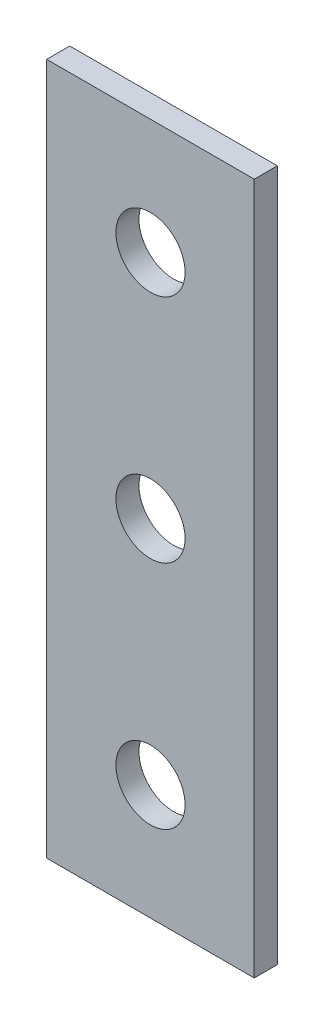
ISO-10303-21;
HEADER;
FILE_DESCRIPTION(('STEP AP214'),'2;1');
FILE_NAME('part.step','',(''),(''),'','','');
FILE_SCHEMA(('AUTOMOTIVE_DESIGN { 1 0 10303 214 1 1 1 1 }'));
ENDSEC;
DATA;
#1=APPLICATION_CONTEXT('core data for automotive mechanical design processes');
#2=APPLICATION_PROTOCOL_DEFINITION('international standard','automotive_design',2000,#1);
#3=PRODUCT_CONTEXT('',#1,'mechanical');
#4=PRODUCT('Part','Part','',(#3));
#5=PRODUCT_RELATED_PRODUCT_CATEGORY('part','',(#4));
#6=PRODUCT_DEFINITION_FORMATION('','',#4);
#7=PRODUCT_DEFINITION_CONTEXT('part definition',#1,'design');
#8=PRODUCT_DEFINITION('design','',#6,#7);
#9=PRODUCT_DEFINITION_SHAPE('','',#8);
#10=(LENGTH_UNIT() NAMED_UNIT(*) SI_UNIT(.MILLI.,.METRE.));
#11=(NAMED_UNIT(*) PLANE_ANGLE_UNIT() SI_UNIT($,.RADIAN.));
#12=(NAMED_UNIT(*) SI_UNIT($,.STERADIAN.) SOLID_ANGLE_UNIT());
#13=UNCERTAINTY_MEASURE_WITH_UNIT(LENGTH_MEASURE(1.E-05),#10,'distance_accuracy_value','');
#14=(GEOMETRIC_REPRESENTATION_CONTEXT(3) GLOBAL_UNCERTAINTY_ASSIGNED_CONTEXT((#13)) GLOBAL_UNIT_ASSIGNED_CONTEXT((#10,
#11,#12)) REPRESENTATION_CONTEXT('',''));
#15=CARTESIAN_POINT('',(0.,0.,0.));
#16=DIRECTION('',(0.,0.,1.));
#17=DIRECTION('',(1.,0.,0.));
#18=AXIS2_PLACEMENT_3D('',#15,#16,#17);
#19=CARTESIAN_POINT('',(0.,0.,1.));
#20=DIRECTION('',(0.,0.,-1.));
#21=DIRECTION('',(-1.,0.,0.));
#22=AXIS2_PLACEMENT_3D('',#19,#20,#21);
#23=PLANE('',#22);
#24=DIRECTION('',(1.,0.,0.));
#25=VECTOR('',#24,1.);
#26=CARTESIAN_POINT('',(9.,0.,1.));
#27=LINE('',#26,#25);
#28=CARTESIAN_POINT('',(0.,0.,1.));
#29=VERTEX_POINT('',#28);
#30=CARTESIAN_POINT('',(9.,0.,1.));
#31=VERTEX_POINT('',#30);
#32=EDGE_CURVE('E92',#29,#31,#27,.T.);
#33=ORIENTED_EDGE('',*,*,#32,.T.);
#34=DIRECTION('',(0.,1.,0.));
#35=VECTOR('',#34,1.);
#36=CARTESIAN_POINT('',(9.,30.,1.));
#37=LINE('',#36,#35);
#38=CARTESIAN_POINT('',(9.,30.,1.));
#39=VERTEX_POINT('',#38);
#40=EDGE_CURVE('E87',#31,#39,#37,.T.);
#41=ORIENTED_EDGE('',*,*,#40,.T.);
#42=DIRECTION('',(-1.,0.,0.));
#43=VECTOR('',#42,1.);
#44=CARTESIAN_POINT('',(0.,30.,1.));
#45=LINE('',#44,#43);
#46=CARTESIAN_POINT('',(0.,30.,1.));
#47=VERTEX_POINT('',#46);
#48=EDGE_CURVE('E90',#39,#47,#45,.T.);
#49=ORIENTED_EDGE('',*,*,#48,.T.);
#50=DIRECTION('',(0.,-1.,0.));
#51=VECTOR('',#50,1.);
#52=CARTESIAN_POINT('',(0.,0.,1.));
#53=LINE('',#52,#51);
#54=EDGE_CURVE('E57',#47,#29,#53,.T.);
#55=ORIENTED_EDGE('',*,*,#54,.T.);
#56=EDGE_LOOP('',(#33,#41,#49,#55));
#57=FACE_BOUND('',#56,.T.);
#58=CARTESIAN_POINT('',(4.5,25.,1.));
#59=DIRECTION('',(0.,0.,1.));
#60=DIRECTION('',(1.,0.,0.));
#61=AXIS2_PLACEMENT_3D('',#58,#59,#60);
#62=CIRCLE('',#61,1.5);
#63=CARTESIAN_POINT('',(6.,25.,1.));
#64=VERTEX_POINT('',#63);
#65=EDGE_CURVE('E112',#64,#64,#62,.T.);
#66=ORIENTED_EDGE('',*,*,#65,.F.);
#67=EDGE_LOOP('',(#66));
#68=FACE_BOUND('',#67,.T.);
#69=CARTESIAN_POINT('',(4.5,15.,1.));
#70=DIRECTION('',(0.,0.,1.));
#71=DIRECTION('',(1.,0.,0.));
#72=AXIS2_PLACEMENT_3D('',#69,#70,#71);
#73=CIRCLE('',#72,1.5);
#74=CARTESIAN_POINT('',(6.,15.,1.));
#75=VERTEX_POINT('',#74);
#76=EDGE_CURVE('E134',#75,#75,#73,.T.);
#77=ORIENTED_EDGE('',*,*,#76,.F.);
#78=EDGE_LOOP('',(#77));
#79=FACE_BOUND('',#78,.T.);
#80=CARTESIAN_POINT('',(4.5,5.,1.));
#81=DIRECTION('',(0.,0.,1.));
#82=DIRECTION('',(1.,0.,0.));
#83=AXIS2_PLACEMENT_3D('',#80,#81,#82);
#84=CIRCLE('',#83,1.5);
#85=CARTESIAN_POINT('',(6.,5.,1.));
#86=VERTEX_POINT('',#85);
#87=EDGE_CURVE('E142',#86,#86,#84,.T.);
#88=ORIENTED_EDGE('',*,*,#87,.F.);
#89=EDGE_LOOP('',(#88));
#90=FACE_BOUND('',#89,.T.);
#91=ADVANCED_FACE('F39',(#57,#68,#79,#90),#23,.F.);
#92=CARTESIAN_POINT('',(0.,0.,0.));
#93=DIRECTION('',(0.,0.,-1.));
#94=DIRECTION('',(-1.,0.,0.));
#95=AXIS2_PLACEMENT_3D('',#92,#93,#94);
#96=PLANE('',#95);
#97=CARTESIAN_POINT('',(4.5,15.,0.));
#98=DIRECTION('',(0.,0.,1.));
#99=DIRECTION('',(1.,0.,0.));
#100=AXIS2_PLACEMENT_3D('',#97,#98,#99);
#101=CIRCLE('',#100,1.5);
#102=CARTESIAN_POINT('',(6.,15.,0.));
#103=VERTEX_POINT('',#102);
#104=EDGE_CURVE('E138',#103,#103,#101,.T.);
#105=ORIENTED_EDGE('',*,*,#104,.T.);
#106=EDGE_LOOP('',(#105));
#107=FACE_BOUND('',#106,.T.);
#108=DIRECTION('',(1.,0.,0.));
#109=VECTOR('',#108,1.);
#110=CARTESIAN_POINT('',(9.,0.,0.));
#111=LINE('',#110,#109);
#112=CARTESIAN_POINT('',(0.,0.,0.));
#113=VERTEX_POINT('',#112);
#114=CARTESIAN_POINT('',(9.,0.,0.));
#115=VERTEX_POINT('',#114);
#116=EDGE_CURVE('E108',#113,#115,#111,.T.);
#117=ORIENTED_EDGE('',*,*,#116,.F.);
#118=DIRECTION('',(0.,-1.,0.));
#119=VECTOR('',#118,1.);
#120=CARTESIAN_POINT('',(0.,0.,0.));
#121=LINE('',#120,#119);
#122=CARTESIAN_POINT('',(0.,30.,0.));
#123=VERTEX_POINT('',#122);
#124=EDGE_CURVE('E80',#123,#113,#121,.T.);
#125=ORIENTED_EDGE('',*,*,#124,.F.);
#126=DIRECTION('',(-1.,0.,0.));
#127=VECTOR('',#126,1.);
#128=CARTESIAN_POINT('',(0.,30.,0.));
#129=LINE('',#128,#127);
#130=CARTESIAN_POINT('',(9.,30.,0.));
#131=VERTEX_POINT('',#130);
#132=EDGE_CURVE('E74',#131,#123,#129,.T.);
#133=ORIENTED_EDGE('',*,*,#132,.F.);
#134=DIRECTION('',(0.,1.,0.));
#135=VECTOR('',#134,1.);
#136=CARTESIAN_POINT('',(9.,30.,0.));
#137=LINE('',#136,#135);
#138=EDGE_CURVE('E97',#115,#131,#137,.T.);
#139=ORIENTED_EDGE('',*,*,#138,.F.);
#140=EDGE_LOOP('',(#117,#125,#133,#139));
#141=FACE_BOUND('',#140,.T.);
#142=CARTESIAN_POINT('',(4.5,25.,0.));
#143=DIRECTION('',(0.,0.,1.));
#144=DIRECTION('',(1.,0.,0.));
#145=AXIS2_PLACEMENT_3D('',#142,#143,#144);
#146=CIRCLE('',#145,1.5);
#147=CARTESIAN_POINT('',(6.,25.,0.));
#148=VERTEX_POINT('',#147);
#149=EDGE_CURVE('E130',#148,#148,#146,.T.);
#150=ORIENTED_EDGE('',*,*,#149,.T.);
#151=EDGE_LOOP('',(#150));
#152=FACE_BOUND('',#151,.T.);
#153=CARTESIAN_POINT('',(4.5,5.,0.));
#154=DIRECTION('',(0.,0.,1.));
#155=DIRECTION('',(1.,0.,0.));
#156=AXIS2_PLACEMENT_3D('',#153,#154,#155);
#157=CIRCLE('',#156,1.5);
#158=CARTESIAN_POINT('',(6.,5.,0.));
#159=VERTEX_POINT('',#158);
#160=EDGE_CURVE('E146',#159,#159,#157,.T.);
#161=ORIENTED_EDGE('',*,*,#160,.T.);
#162=EDGE_LOOP('',(#161));
#163=FACE_BOUND('',#162,.T.);
#164=ADVANCED_FACE('F125',(#107,#141,#152,#163),#96,.T.);
#165=CARTESIAN_POINT('',(9.,0.,1.));
#166=DIRECTION('',(0.,1.,0.));
#167=DIRECTION('',(0.,0.,1.));
#168=AXIS2_PLACEMENT_3D('',#165,#166,#167);
#169=PLANE('',#168);
#170=ORIENTED_EDGE('',*,*,#116,.T.);
#171=DIRECTION('',(0.,0.,-1.));
#172=VECTOR('',#171,1.);
#173=CARTESIAN_POINT('',(9.,0.,1.));
#174=LINE('',#173,#172);
#175=EDGE_CURVE('E11',#31,#115,#174,.T.);
#176=ORIENTED_EDGE('',*,*,#175,.F.);
#177=ORIENTED_EDGE('',*,*,#32,.F.);
#178=DIRECTION('',(0.,0.,-1.));
#179=VECTOR('',#178,1.);
#180=CARTESIAN_POINT('',(0.,0.,1.));
#181=LINE('',#180,#179);
#182=EDGE_CURVE('E104',#29,#113,#181,.T.);
#183=ORIENTED_EDGE('',*,*,#182,.T.);
#184=EDGE_LOOP('',(#170,#176,#177,#183));
#185=FACE_BOUND('',#184,.T.);
#186=ADVANCED_FACE('F41',(#185),#169,.F.);
#187=CARTESIAN_POINT('',(9.,30.,1.));
#188=DIRECTION('',(-1.,0.,0.));
#189=DIRECTION('',(0.,0.,1.));
#190=AXIS2_PLACEMENT_3D('',#187,#188,#189);
#191=PLANE('',#190);
#192=ORIENTED_EDGE('',*,*,#138,.T.);
#193=DIRECTION('',(0.,0.,-1.));
#194=VECTOR('',#193,1.);
#195=CARTESIAN_POINT('',(9.,30.,1.));
#196=LINE('',#195,#194);
#197=EDGE_CURVE('E49',#39,#131,#196,.T.);
#198=ORIENTED_EDGE('',*,*,#197,.F.);
#199=ORIENTED_EDGE('',*,*,#40,.F.);
#200=ORIENTED_EDGE('',*,*,#175,.T.);
#201=EDGE_LOOP('',(#192,#198,#199,#200));
#202=FACE_BOUND('',#201,.T.);
#203=ADVANCED_FACE('F96',(#202),#191,.F.);
#204=CARTESIAN_POINT('',(0.,30.,1.));
#205=DIRECTION('',(0.,-1.,0.));
#206=DIRECTION('',(0.,0.,-1.));
#207=AXIS2_PLACEMENT_3D('',#204,#205,#206);
#208=PLANE('',#207);
#209=ORIENTED_EDGE('',*,*,#132,.T.);
#210=DIRECTION('',(0.,0.,-1.));
#211=VECTOR('',#210,1.);
#212=CARTESIAN_POINT('',(0.,30.,1.));
#213=LINE('',#212,#211);
#214=EDGE_CURVE('E99',#47,#123,#213,.T.);
#215=ORIENTED_EDGE('',*,*,#214,.F.);
#216=ORIENTED_EDGE('',*,*,#48,.F.);
#217=ORIENTED_EDGE('',*,*,#197,.T.);
#218=EDGE_LOOP('',(#209,#215,#216,#217));
#219=FACE_BOUND('',#218,.T.);
#220=ADVANCED_FACE('F100',(#219),#208,.F.);
#221=CARTESIAN_POINT('',(0.,0.,1.));
#222=DIRECTION('',(1.,0.,0.));
#223=DIRECTION('',(0.,0.,-1.));
#224=AXIS2_PLACEMENT_3D('',#221,#222,#223);
#225=PLANE('',#224);
#226=ORIENTED_EDGE('',*,*,#124,.T.);
#227=ORIENTED_EDGE('',*,*,#182,.F.);
#228=ORIENTED_EDGE('',*,*,#54,.F.);
#229=ORIENTED_EDGE('',*,*,#214,.T.);
#230=EDGE_LOOP('',(#226,#227,#228,#229));
#231=FACE_BOUND('',#230,.T.);
#232=ADVANCED_FACE('F122',(#231),#225,.F.);
#233=CARTESIAN_POINT('',(4.5,25.,1.));
#234=DIRECTION('',(0.,0.,-1.));
#235=DIRECTION('',(-1.,0.,0.));
#236=AXIS2_PLACEMENT_3D('',#233,#234,#235);
#237=CYLINDRICAL_SURFACE('',#236,1.5);
#238=ORIENTED_EDGE('',*,*,#65,.T.);
#239=EDGE_LOOP('',(#238));
#240=FACE_BOUND('',#239,.T.);
#241=ORIENTED_EDGE('',*,*,#149,.F.);
#242=EDGE_LOOP('',(#241));
#243=FACE_BOUND('',#242,.T.);
#244=ADVANCED_FACE('F165',(#240,#243),#237,.F.);
#245=CARTESIAN_POINT('',(4.5,15.,1.));
#246=DIRECTION('',(0.,0.,-1.));
#247=DIRECTION('',(-1.,0.,0.));
#248=AXIS2_PLACEMENT_3D('',#245,#246,#247);
#249=CYLINDRICAL_SURFACE('',#248,1.5);
#250=ORIENTED_EDGE('',*,*,#76,.T.);
#251=EDGE_LOOP('',(#250));
#252=FACE_BOUND('',#251,.T.);
#253=ORIENTED_EDGE('',*,*,#104,.F.);
#254=EDGE_LOOP('',(#253));
#255=FACE_BOUND('',#254,.T.);
#256=ADVANCED_FACE('F211',(#252,#255),#249,.F.);
#257=CARTESIAN_POINT('',(4.5,5.,1.));
#258=DIRECTION('',(0.,0.,-1.));
#259=DIRECTION('',(-1.,0.,0.));
#260=AXIS2_PLACEMENT_3D('',#257,#258,#259);
#261=CYLINDRICAL_SURFACE('',#260,1.5);
#262=ORIENTED_EDGE('',*,*,#87,.T.);
#263=EDGE_LOOP('',(#262));
#264=FACE_BOUND('',#263,.T.);
#265=ORIENTED_EDGE('',*,*,#160,.F.);
#266=EDGE_LOOP('',(#265));
#267=FACE_BOUND('',#266,.T.);
#268=ADVANCED_FACE('F154',(#264,#267),#261,.F.);
#269=CLOSED_SHELL('',(#91,#164,#186,#203,#220,#232,#244,#256,#268));
#270=MANIFOLD_SOLID_BREP('B2',#269);
#271=ADVANCED_BREP_SHAPE_REPRESENTATION('',(#18,#270),#14);
#272=SHAPE_DEFINITION_REPRESENTATION(#9,#271);
ENDSEC;
END-ISO-10303-21;
